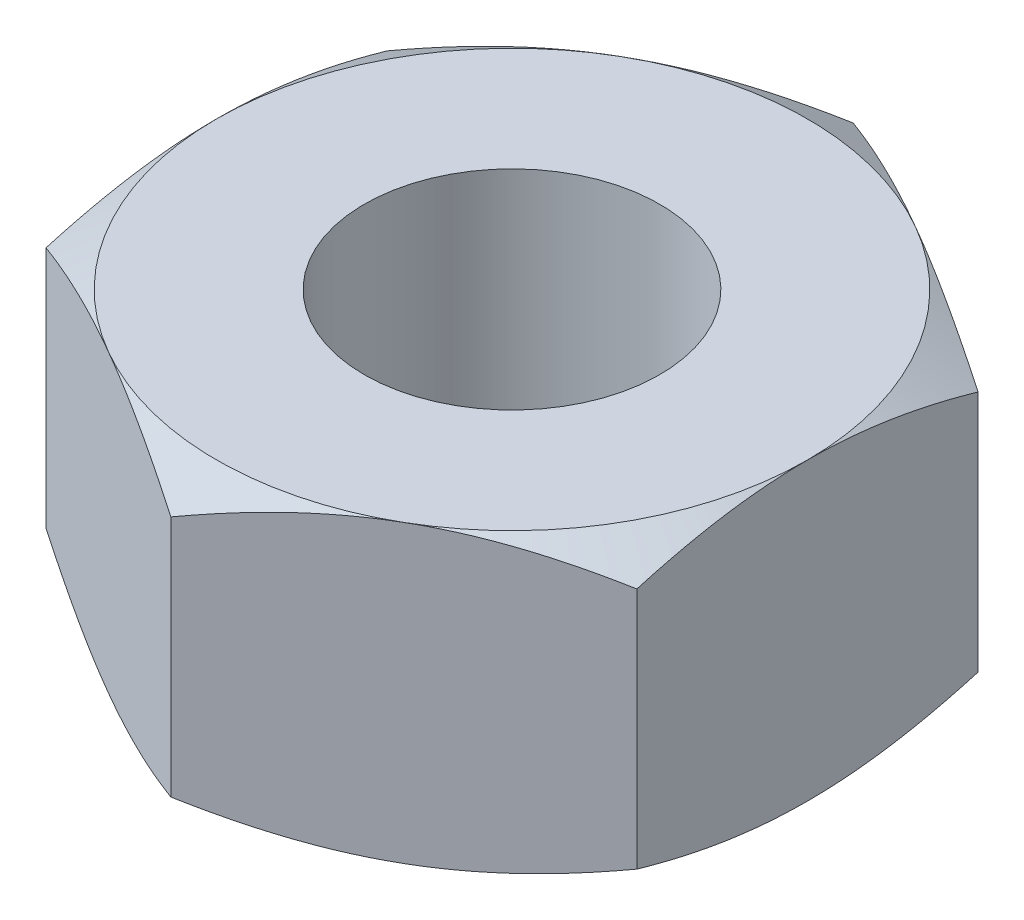
ISO-10303-21;
HEADER;
FILE_DESCRIPTION(('STEP AP214'),'2;1');
FILE_NAME('part.step','',(''),(''),'','','');
FILE_SCHEMA(('AUTOMOTIVE_DESIGN { 1 0 10303 214 1 1 1 1 }'));
ENDSEC;
DATA;
#1=APPLICATION_CONTEXT('core data for automotive mechanical design processes');
#2=APPLICATION_PROTOCOL_DEFINITION('international standard','automotive_design',2000,#1);
#3=PRODUCT_CONTEXT('',#1,'mechanical');
#4=PRODUCT('Part','Part','',(#3));
#5=PRODUCT_RELATED_PRODUCT_CATEGORY('part','',(#4));
#6=PRODUCT_DEFINITION_FORMATION('','',#4);
#7=PRODUCT_DEFINITION_CONTEXT('part definition',#1,'design');
#8=PRODUCT_DEFINITION('design','',#6,#7);
#9=PRODUCT_DEFINITION_SHAPE('','',#8);
#10=(LENGTH_UNIT() NAMED_UNIT(*) SI_UNIT(.MILLI.,.METRE.));
#11=(NAMED_UNIT(*) PLANE_ANGLE_UNIT() SI_UNIT($,.RADIAN.));
#12=(NAMED_UNIT(*) SI_UNIT($,.STERADIAN.) SOLID_ANGLE_UNIT());
#13=UNCERTAINTY_MEASURE_WITH_UNIT(LENGTH_MEASURE(1.E-05),#10,'distance_accuracy_value','');
#14=(GEOMETRIC_REPRESENTATION_CONTEXT(3) GLOBAL_UNCERTAINTY_ASSIGNED_CONTEXT((#13)) GLOBAL_UNIT_ASSIGNED_CONTEXT((#10,
#11,#12)) REPRESENTATION_CONTEXT('',''));
#15=CARTESIAN_POINT('',(0.,0.,0.));
#16=DIRECTION('',(0.,0.,1.));
#17=DIRECTION('',(1.,0.,0.));
#18=AXIS2_PLACEMENT_3D('',#15,#16,#17);
#19=CARTESIAN_POINT('',(2.,2.,-1.15470053837925));
#20=DIRECTION('',(-0.5,0.,0.866025403784439));
#21=DIRECTION('',(0.866025403784439,0.,0.5));
#22=AXIS2_PLACEMENT_3D('',#19,#20,#21);
#23=PLANE('',#22);
#24=CARTESIAN_POINT('',(-0.000200000000000763,0.178699466620498,-2.30951654681234));
#25=CARTESIAN_POINT('',(0.0876912629000593,0.149389536100678,-2.25877250251758));
#26=CARTESIAN_POINT('',(0.17634119447359,0.122732851980467,-2.20759044065996));
#27=CARTESIAN_POINT('',(0.355176246997801,0.0762024910207211,-2.10433997494456));
#28=CARTESIAN_POINT('',(0.445364546505036,0.0563452763827793,-2.0522697359463));
#29=CARTESIAN_POINT('',(0.624623385763305,0.0254334640232528,-1.94877459684592));
#30=CARTESIAN_POINT('',(0.713666338226303,0.0141731515985312,-1.89736562427197));
#31=CARTESIAN_POINT('',(0.892171397785042,0.000728662594641872,-1.79430568008402));
#32=CARTESIAN_POINT('',(0.981632855703957,-0.00146664504653174,-1.74265508327244));
#33=CARTESIAN_POINT('',(1.1488083535488,0.0030909893306489,-1.64613626458981));
#34=CARTESIAN_POINT('',(1.22654737026578,0.00872487468701465,-1.60125362236173));
#35=CARTESIAN_POINT('',(1.38151891453613,0.0265838952608283,-1.51178075956051));
#36=CARTESIAN_POINT('',(1.4587509057412,0.0388151360234393,-1.46719084864821));
#37=CARTESIAN_POINT('',(1.6140421864822,0.0693934368676097,-1.37753338590959));
#38=CARTESIAN_POINT('',(1.69208181310738,0.0878701670657159,-1.33247718647009));
#39=CARTESIAN_POINT('',(1.84699686569213,0.129805518212856,-1.24303693915875));
#40=CARTESIAN_POINT('',(1.92387427762312,0.153254280492313,-1.1986517446858));
#41=CARTESIAN_POINT('',(2.0002,0.178699466620497,-1.15458506832541));
#42=B_SPLINE_CURVE_WITH_KNOTS('',3,(#24,#25,#26,#27,#28,#29,#30,#31,#32,#33,#34,#35,#36,#37,#38,
#39,#40,#41),.UNSPECIFIED.,.F.,.F.,(4,2,2,2,2,2,2,2,4),(0.,0.317031824695609,0.634825876346563,
0.944753967652635,1.25430138000371,1.52387047293094,1.79368946861028,2.06949491027634,
2.34475850821472),.UNSPECIFIED.);
#43=CARTESIAN_POINT('',(0.,0.178632794954081,-2.3094010767585));
#44=VERTEX_POINT('',#43);
#45=CARTESIAN_POINT('',(0.999999999999999,0.,-1.73205080756888));
#46=VERTEX_POINT('',#45);
#47=EDGE_CURVE('E53',#44,#46,#42,.T.);
#48=ORIENTED_EDGE('',*,*,#47,.F.);
#49=DIRECTION('',(0.,-1.,0.));
#50=VECTOR('',#49,1.);
#51=CARTESIAN_POINT('',(0.,2.,-2.3094010767585));
#52=LINE('',#51,#50);
#53=CARTESIAN_POINT('',(0.,1.82136720504592,-2.3094010767585));
#54=VERTEX_POINT('',#53);
#55=EDGE_CURVE('E279',#54,#44,#52,.T.);
#56=ORIENTED_EDGE('',*,*,#55,.F.);
#57=CARTESIAN_POINT('',(2.0002,1.8213005333795,-1.15458506832541));
#58=CARTESIAN_POINT('',(1.91230873709994,1.85061046389932,-1.20532911262018));
#59=CARTESIAN_POINT('',(1.82365880552641,1.87726714801953,-1.2565111744778));
#60=CARTESIAN_POINT('',(1.6448237530022,1.92379750897928,-1.35976164019319));
#61=CARTESIAN_POINT('',(1.55463545349496,1.94365472361722,-1.41183187919145));
#62=CARTESIAN_POINT('',(1.37537661423669,1.97456653597675,-1.51532701829183));
#63=CARTESIAN_POINT('',(1.2863336617737,1.98582684840147,-1.56673599086578));
#64=CARTESIAN_POINT('',(1.10782860221496,1.99927133740536,-1.66979593505373));
#65=CARTESIAN_POINT('',(1.01836714429604,2.00146664504653,-1.72144653186531));
#66=CARTESIAN_POINT('',(0.851191646451201,1.99690901066935,-1.81796535054794));
#67=CARTESIAN_POINT('',(0.773452629734215,1.99127512531299,-1.86284799277603));
#68=CARTESIAN_POINT('',(0.618481085463866,1.97341610473917,-1.95232085557725));
#69=CARTESIAN_POINT('',(0.541249094258801,1.96118486397656,-1.99691076648954));
#70=CARTESIAN_POINT('',(0.385957813517798,1.93060656313239,-2.08656822922816));
#71=CARTESIAN_POINT('',(0.30791818689262,1.91212983293428,-2.13162442866767));
#72=CARTESIAN_POINT('',(0.153003134307865,1.87019448178714,-2.221064675979));
#73=CARTESIAN_POINT('',(0.0761257223768794,1.84674571950769,-2.26544987045196));
#74=CARTESIAN_POINT('',(-0.000200000000000733,1.8213005333795,-2.30951654681234));
#75=B_SPLINE_CURVE_WITH_KNOTS('',3,(#57,#58,#59,#60,#61,#62,#63,#64,#65,#66,#67,#68,#69,#70,#71,
#72,#73,#74),.UNSPECIFIED.,.F.,.F.,(4,2,2,2,2,2,2,2,4),(0.,0.317031824695609,0.634825876346563,
0.944753967652635,1.25430138000371,1.52387047293094,1.79368946861028,2.06949491027634,
2.34475850821472),.UNSPECIFIED.);
#76=CARTESIAN_POINT('',(0.999999999999999,2.,-1.73205080756888));
#77=VERTEX_POINT('',#76);
#78=EDGE_CURVE('E251',#77,#54,#75,.T.);
#79=ORIENTED_EDGE('',*,*,#78,.F.);
#80=CARTESIAN_POINT('',(2.,1.82136720504592,-1.15470053837926));
#81=VERTEX_POINT('',#80);
#82=EDGE_CURVE('E319',#81,#77,#75,.T.);
#83=ORIENTED_EDGE('',*,*,#82,.F.);
#84=DIRECTION('',(0.,-1.,0.));
#85=VECTOR('',#84,1.);
#86=CARTESIAN_POINT('',(2.,2.,-1.15470053837925));
#87=LINE('',#86,#85);
#88=CARTESIAN_POINT('',(2.,0.178632794954081,-1.15470053837925));
#89=VERTEX_POINT('',#88);
#90=EDGE_CURVE('E321',#81,#89,#87,.T.);
#91=ORIENTED_EDGE('',*,*,#90,.T.);
#92=EDGE_CURVE('E138',#46,#89,#42,.T.);
#93=ORIENTED_EDGE('',*,*,#92,.F.);
#94=EDGE_LOOP('',(#48,#56,#79,#83,#91,#93));
#95=FACE_BOUND('',#94,.T.);
#96=ADVANCED_FACE('F37',(#95),#23,.F.);
#97=CARTESIAN_POINT('',(0.,2.,-2.3094010767585));
#98=DIRECTION('',(0.5,0.,0.866025403784439));
#99=DIRECTION('',(0.866025403784439,0.,-0.5));
#100=AXIS2_PLACEMENT_3D('',#97,#98,#99);
#101=PLANE('',#100);
#102=CARTESIAN_POINT('',(-2.0002,0.178699466620498,-1.15458506832541));
#103=CARTESIAN_POINT('',(-1.91230873709994,0.149389536100679,-1.20532911262018));
#104=CARTESIAN_POINT('',(-1.82365880552641,0.122732851980467,-1.2565111744778));
#105=CARTESIAN_POINT('',(-1.6448237530022,0.0762024910207211,-1.35976164019319));
#106=CARTESIAN_POINT('',(-1.55463545349496,0.0563452763827793,-1.41183187919145));
#107=CARTESIAN_POINT('',(-1.37537661423669,0.0254334640232529,-1.51532701829183));
#108=CARTESIAN_POINT('',(-1.2863336617737,0.0141731515985316,-1.56673599086578));
#109=CARTESIAN_POINT('',(-1.10782860221496,0.000728662594642286,-1.66979593505373));
#110=CARTESIAN_POINT('',(-1.01836714429604,-0.00146664504653146,-1.72144653186531));
#111=CARTESIAN_POINT('',(-0.851191646451202,0.00309098933064913,-1.81796535054794));
#112=CARTESIAN_POINT('',(-0.773452629734217,0.00872487468701495,-1.86284799277603));
#113=CARTESIAN_POINT('',(-0.618481085463867,0.0265838952608288,-1.95232085557725));
#114=CARTESIAN_POINT('',(-0.541249094258802,0.0388151360234398,-1.99691076648954));
#115=CARTESIAN_POINT('',(-0.3859578135178,0.0693934368676101,-2.08656822922816));
#116=CARTESIAN_POINT('',(-0.307918186892621,0.0878701670657161,-2.13162442866767));
#117=CARTESIAN_POINT('',(-0.153003134307866,0.129805518212856,-2.221064675979));
#118=CARTESIAN_POINT('',(-0.0761257223768804,0.153254280492313,-2.26544987045196));
#119=CARTESIAN_POINT('',(0.000199999999999368,0.178699466620498,-2.30951654681234));
#120=B_SPLINE_CURVE_WITH_KNOTS('',3,(#102,#103,#104,#105,#106,#107,#108,#109,#110,#111,#112,
#113,#114,#115,#116,#117,#118,#119),.UNSPECIFIED.,.F.,.F.,(4,2,2,2,2,2,2,2,4),(0.,
0.31703182469561,0.634825876346563,0.944753967652636,1.25430138000371,1.52387047293094,
1.79368946861028,2.06949491027634,2.34475850821472),.UNSPECIFIED.);
#121=CARTESIAN_POINT('',(-2.,0.178632794954081,-1.15470053837925));
#122=VERTEX_POINT('',#121);
#123=CARTESIAN_POINT('',(-1.,0.,-1.73205080756888));
#124=VERTEX_POINT('',#123);
#125=EDGE_CURVE('E61',#122,#124,#120,.T.);
#126=ORIENTED_EDGE('',*,*,#125,.F.);
#127=DIRECTION('',(0.,-1.,0.));
#128=VECTOR('',#127,1.);
#129=CARTESIAN_POINT('',(-2.,2.,-1.15470053837925));
#130=LINE('',#129,#128);
#131=CARTESIAN_POINT('',(-2.,1.82136720504592,-1.15470053837925));
#132=VERTEX_POINT('',#131);
#133=EDGE_CURVE('E272',#132,#122,#130,.T.);
#134=ORIENTED_EDGE('',*,*,#133,.F.);
#135=CARTESIAN_POINT('',(0.0001999999999992,1.8213005333795,-2.30951654681234));
#136=CARTESIAN_POINT('',(-0.0876912629000608,1.85061046389932,-2.25877250251758));
#137=CARTESIAN_POINT('',(-0.176341194473592,1.87726714801953,-2.20759044065996));
#138=CARTESIAN_POINT('',(-0.355176246997803,1.92379750897928,-2.10433997494456));
#139=CARTESIAN_POINT('',(-0.445364546505037,1.94365472361722,-2.05226973594631));
#140=CARTESIAN_POINT('',(-0.624623385763307,1.97456653597675,-1.94877459684592));
#141=CARTESIAN_POINT('',(-0.713666338226305,1.98582684840147,-1.89736562427197));
#142=CARTESIAN_POINT('',(-0.892171397785044,1.99927133740536,-1.79430568008402));
#143=CARTESIAN_POINT('',(-0.981632855703959,2.00146664504653,-1.74265508327244));
#144=CARTESIAN_POINT('',(-1.1488083535488,1.99690901066935,-1.64613626458981));
#145=CARTESIAN_POINT('',(-1.22654737026578,1.99127512531299,-1.60125362236173));
#146=CARTESIAN_POINT('',(-1.38151891453613,1.97341610473917,-1.51178075956051));
#147=CARTESIAN_POINT('',(-1.4587509057412,1.96118486397656,-1.46719084864821));
#148=CARTESIAN_POINT('',(-1.6140421864822,1.93060656313239,-1.37753338590959));
#149=CARTESIAN_POINT('',(-1.69208181310738,1.91212983293428,-1.33247718647009));
#150=CARTESIAN_POINT('',(-1.84699686569214,1.87019448178714,-1.24303693915875));
#151=CARTESIAN_POINT('',(-1.92387427762312,1.84674571950769,-1.1986517446858));
#152=CARTESIAN_POINT('',(-2.0002,1.8213005333795,-1.15458506832541));
#153=B_SPLINE_CURVE_WITH_KNOTS('',3,(#135,#136,#137,#138,#139,#140,#141,#142,#143,#144,#145,
#146,#147,#148,#149,#150,#151,#152),.UNSPECIFIED.,.F.,.F.,(4,2,2,2,2,2,2,2,4),(0.,
0.31703182469561,0.634825876346563,0.944753967652636,1.25430138000371,1.52387047293094,
1.79368946861028,2.06949491027634,2.34475850821472),.UNSPECIFIED.);
#154=CARTESIAN_POINT('',(-1.,2.,-1.73205080756888));
#155=VERTEX_POINT('',#154);
#156=EDGE_CURVE('E244',#155,#132,#153,.T.);
#157=ORIENTED_EDGE('',*,*,#156,.F.);
#158=EDGE_CURVE('E250',#54,#155,#153,.T.);
#159=ORIENTED_EDGE('',*,*,#158,.F.);
#160=ORIENTED_EDGE('',*,*,#55,.T.);
#161=EDGE_CURVE('E161',#124,#44,#120,.T.);
#162=ORIENTED_EDGE('',*,*,#161,.F.);
#163=EDGE_LOOP('',(#126,#134,#157,#159,#160,#162));
#164=FACE_BOUND('',#163,.T.);
#165=ADVANCED_FACE('F257',(#164),#101,.F.);
#166=CARTESIAN_POINT('',(-2.,2.,-1.15470053837925));
#167=DIRECTION('',(1.,0.,0.));
#168=DIRECTION('',(0.,0.,-1.));
#169=AXIS2_PLACEMENT_3D('',#166,#167,#168);
#170=PLANE('',#169);
#171=CARTESIAN_POINT('',(-2.,1.48527851081329,4.11199077583192));
#172=CARTESIAN_POINT('',(-2.,1.43556064912627,4.01621889999879));
#173=CARTESIAN_POINT('',(-2.,1.3860944255792,3.92031530027965));
#174=CARTESIAN_POINT('',(-2.,1.28779407427013,3.72818291926333));
#175=CARTESIAN_POINT('',(-2.,1.23895995674012,3.631954132734));
#176=CARTESIAN_POINT('',(-2.,1.14197770267674,3.43896040283808));
#177=CARTESIAN_POINT('',(-2.,1.09383077181164,3.34219485259439));
#178=CARTESIAN_POINT('',(-2.,0.998479885570913,3.14819793764471));
#179=CARTESIAN_POINT('',(-2.,0.951275943075933,3.05096656659833));
#180=CARTESIAN_POINT('',(-2.,0.855458409955278,2.85053512168431));
#181=CARTESIAN_POINT('',(-2.,0.806911736470797,2.74730297037766));
#182=CARTESIAN_POINT('',(-2.,0.711493100390036,2.54006824196301));
#183=CARTESIAN_POINT('',(-2.,0.664621094945287,2.43606568464913));
#184=CARTESIAN_POINT('',(-2.,0.573080172427993,2.22717408130948));
#185=CARTESIAN_POINT('',(-2.,0.52840979119064,2.12228568029937));
#186=CARTESIAN_POINT('',(-2.,0.441918323549794,1.91130709903764));
#187=CARTESIAN_POINT('',(-2.,0.400097863664024,1.80521666047395));
#188=CARTESIAN_POINT('',(-2.,0.315154144144186,1.57793145478542));
#189=CARTESIAN_POINT('',(-2.,0.272548573404193,1.45654057209064));
#190=CARTESIAN_POINT('',(-2.,0.194083857834814,1.21162099045195));
#191=CARTESIAN_POINT('',(-2.,0.158221425471686,1.0880933654963));
#192=CARTESIAN_POINT('',(-2.,0.0963560948112605,0.841146101707505));
#193=CARTESIAN_POINT('',(-2.,0.0701708352319793,0.717773436781328));
#194=CARTESIAN_POINT('',(-2.,0.0293524563339624,0.469134271856654));
#195=CARTESIAN_POINT('',(-2.,0.0147123206570906,0.343868969330864));
#196=CARTESIAN_POINT('',(-2.,-0.00113662864390631,0.090487427083638));
#197=CARTESIAN_POINT('',(-2.,-0.00213264744638916,-0.037642825220359));
#198=CARTESIAN_POINT('',(-2.,0.0100200278550488,-0.293230873703655));
#199=CARTESIAN_POINT('',(-2.,0.0231726133836598,-0.420688475186085));
#200=CARTESIAN_POINT('',(-2.,0.0621057262002386,-0.676342906930762));
#201=CARTESIAN_POINT('',(-2.,0.088147692363252,-0.804498264161085));
#202=CARTESIAN_POINT('',(-2.,0.150024683567195,-1.05840042525138));
#203=CARTESIAN_POINT('',(-2.,0.185863718360607,-1.18414622032496));
#204=CARTESIAN_POINT('',(-2.,0.26511351224471,-1.43483581350434));
#205=CARTESIAN_POINT('',(-2.,0.308609626530992,-1.55975207603836));
#206=CARTESIAN_POINT('',(-2.,0.400793385214287,-1.80767043600752));
#207=CARTESIAN_POINT('',(-2.,0.449482610705792,-1.93067193733758));
#208=CARTESIAN_POINT('',(-2.,0.550637062875052,-2.17527287229393));
#209=CARTESIAN_POINT('',(-2.,0.60310678384142,-2.29687043090538));
#210=CARTESIAN_POINT('',(-2.,0.710763033205786,-2.5388586671706));
#211=CARTESIAN_POINT('',(-2.,0.7659497287733,-2.65924927001311));
#212=CARTESIAN_POINT('',(-2.,0.87489068429636,-2.89171848429236));
#213=CARTESIAN_POINT('',(-2.,0.928524863524456,-3.00385360768881));
#214=CARTESIAN_POINT('',(-2.,1.03716744685329,-3.22746009057916));
#215=CARTESIAN_POINT('',(-2.,1.09217590469003,-3.33893142390634));
#216=CARTESIAN_POINT('',(-2.,1.20305571911547,-3.56091834981154));
#217=CARTESIAN_POINT('',(-2.,1.25892304402674,-3.6714359609046));
#218=CARTESIAN_POINT('',(-2.,1.37151099549244,-3.89202309820636));
#219=CARTESIAN_POINT('',(-2.,1.4282315424678,-4.0020926650018));
#220=CARTESIAN_POINT('',(-2.,1.48527851081329,-4.11199077583192));
#221=B_SPLINE_CURVE_WITH_KNOTS('',3,(#171,#172,#173,#174,#175,#176,#177,#178,#179,#180,#181,
#182,#183,#184,#185,#186,#187,#188,#189,#190,#191,#192,#193,#194,#195,#196,#197,#198,#199,#200,
#201,#202,#203,#204,#205,#206,#207,#208,#209,#210,#211,#212,#213,#214,#215,#216,#217,#218,#219,
#220),.UNSPECIFIED.,.F.,.F.,(4,2,2,2,2,2,2,2,2,2,2,2,2,2,2,2,2,2,2,2,2,2,2,2,4),(0.,
0.32372481305476,0.64745485975366,0.971696364799469,1.29594229576278,1.63816292018737,
1.98037478219133,2.3223559012748,2.66441195948731,3.05022429601378,3.43584804399959,
3.81378148436164,4.19148506453753,4.57507275328391,4.95876597076716,5.3505819713692,
5.74255857547208,6.13921877430159,6.53600008689406,6.93326113751857,7.33054666137,
7.70344029330569,8.07634852873628,8.44785185771417,8.81932074922118),.UNSPECIFIED.);
#222=CARTESIAN_POINT('',(-2.,0.178632794954081,1.15470053837925));
#223=VERTEX_POINT('',#222);
#224=CARTESIAN_POINT('',(-2.,0.,0.));
#225=VERTEX_POINT('',#224);
#226=EDGE_CURVE('E348',#223,#225,#221,.T.);
#227=ORIENTED_EDGE('',*,*,#226,.F.);
#228=DIRECTION('',(0.,-1.,0.));
#229=VECTOR('',#228,1.);
#230=CARTESIAN_POINT('',(-2.,2.,1.15470053837925));
#231=LINE('',#230,#229);
#232=CARTESIAN_POINT('',(-2.,1.82136720504592,1.15470053837925));
#233=VERTEX_POINT('',#232);
#234=EDGE_CURVE('E280',#233,#223,#231,.T.);
#235=ORIENTED_EDGE('',*,*,#234,.F.);
#236=CARTESIAN_POINT('',(-2.,0.514721489186708,-4.11199077583192));
#237=CARTESIAN_POINT('',(-2.,0.564439350873725,-4.01621889999879));
#238=CARTESIAN_POINT('',(-2.,0.613905574420801,-3.92031530027965));
#239=CARTESIAN_POINT('',(-2.,0.712205925729873,-3.72818291926333));
#240=CARTESIAN_POINT('',(-2.,0.761040043259875,-3.631954132734));
#241=CARTESIAN_POINT('',(-2.,0.858022297323263,-3.43896040283808));
#242=CARTESIAN_POINT('',(-2.,0.906169228188361,-3.34219485259439));
#243=CARTESIAN_POINT('',(-2.,1.00152011442909,-3.14819793764471));
#244=CARTESIAN_POINT('',(-2.,1.04872405692407,-3.05096656659833));
#245=CARTESIAN_POINT('',(-2.,1.14454159004472,-2.85053512168431));
#246=CARTESIAN_POINT('',(-2.,1.1930882635292,-2.74730297037766));
#247=CARTESIAN_POINT('',(-2.,1.28850689960996,-2.54006824196301));
#248=CARTESIAN_POINT('',(-2.,1.33537890505471,-2.43606568464913));
#249=CARTESIAN_POINT('',(-2.,1.42691982757201,-2.22717408130948));
#250=CARTESIAN_POINT('',(-2.,1.47159020880936,-2.12228568029937));
#251=CARTESIAN_POINT('',(-2.,1.55808167645021,-1.91130709903764));
#252=CARTESIAN_POINT('',(-2.,1.59990213633598,-1.80521666047395));
#253=CARTESIAN_POINT('',(-2.,1.68484585585581,-1.57793145478542));
#254=CARTESIAN_POINT('',(-2.,1.72745142659581,-1.45654057209064));
#255=CARTESIAN_POINT('',(-2.,1.80591614216519,-1.21162099045195));
#256=CARTESIAN_POINT('',(-2.,1.84177857452831,-1.0880933654963));
#257=CARTESIAN_POINT('',(-2.,1.90364390518874,-0.841146101707505));
#258=CARTESIAN_POINT('',(-2.,1.92982916476802,-0.717773436781327));
#259=CARTESIAN_POINT('',(-2.,1.97064754366604,-0.469134271856653));
#260=CARTESIAN_POINT('',(-2.,1.98528767934291,-0.343868969330863));
#261=CARTESIAN_POINT('',(-2.,2.00113662864391,-0.0904874270836378));
#262=CARTESIAN_POINT('',(-2.,2.00213264744639,0.037642825220359));
#263=CARTESIAN_POINT('',(-2.,1.98997997214495,0.293230873703655));
#264=CARTESIAN_POINT('',(-2.,1.97682738661634,0.420688475186085));
#265=CARTESIAN_POINT('',(-2.,1.93789427379976,0.676342906930762));
#266=CARTESIAN_POINT('',(-2.,1.91185230763675,0.804498264161085));
#267=CARTESIAN_POINT('',(-2.,1.84997531643281,1.05840042525138));
#268=CARTESIAN_POINT('',(-2.,1.81413628163939,1.18414622032496));
#269=CARTESIAN_POINT('',(-2.,1.73488648775529,1.43483581350434));
#270=CARTESIAN_POINT('',(-2.,1.69139037346901,1.55975207603836));
#271=CARTESIAN_POINT('',(-2.,1.59920661478571,1.80767043600752));
#272=CARTESIAN_POINT('',(-2.,1.55051738929421,1.93067193733759));
#273=CARTESIAN_POINT('',(-2.,1.44936293712495,2.17527287229394));
#274=CARTESIAN_POINT('',(-2.,1.39689321615858,2.29687043090538));
#275=CARTESIAN_POINT('',(-2.,1.28923696679421,2.5388586671706));
#276=CARTESIAN_POINT('',(-2.,1.2340502712267,2.65924927001311));
#277=CARTESIAN_POINT('',(-2.,1.12510931570364,2.89171848429237));
#278=CARTESIAN_POINT('',(-2.,1.07147513647554,3.00385360768881));
#279=CARTESIAN_POINT('',(-2.,0.962832553146711,3.22746009057916));
#280=CARTESIAN_POINT('',(-2.,0.907824095309975,3.33893142390634));
#281=CARTESIAN_POINT('',(-2.,0.796944280884527,3.56091834981154));
#282=CARTESIAN_POINT('',(-2.,0.741076955973262,3.6714359609046));
#283=CARTESIAN_POINT('',(-2.,0.628489004507557,3.89202309820636));
#284=CARTESIAN_POINT('',(-2.,0.571768457532199,4.0020926650018));
#285=CARTESIAN_POINT('',(-2.,0.514721489186709,4.11199077583192));
#286=B_SPLINE_CURVE_WITH_KNOTS('',3,(#236,#237,#238,#239,#240,#241,#242,#243,#244,#245,#246,
#247,#248,#249,#250,#251,#252,#253,#254,#255,#256,#257,#258,#259,#260,#261,#262,#263,#264,#265,
#266,#267,#268,#269,#270,#271,#272,#273,#274,#275,#276,#277,#278,#279,#280,#281,#282,#283,#284,
#285),.UNSPECIFIED.,.F.,.F.,(4,2,2,2,2,2,2,2,2,2,2,2,2,2,2,2,2,2,2,2,2,2,2,2,4),(0.,
0.32372481305476,0.64745485975366,0.971696364799469,1.29594229576278,1.63816292018737,
1.98037478219133,2.3223559012748,2.66441195948731,3.05022429601378,3.4358480439996,
3.81378148436164,4.19148506453753,4.57507275328391,4.95876597076716,5.3505819713692,
5.74255857547208,6.13921877430159,6.53600008689406,6.93326113751857,7.33054666137,
7.70344029330569,8.07634852873628,8.44785185771417,8.81932074922118),.UNSPECIFIED.);
#287=CARTESIAN_POINT('',(-2.,2.,0.));
#288=VERTEX_POINT('',#287);
#289=EDGE_CURVE('E237',#288,#233,#286,.T.);
#290=ORIENTED_EDGE('',*,*,#289,.F.);
#291=EDGE_CURVE('E243',#132,#288,#286,.T.);
#292=ORIENTED_EDGE('',*,*,#291,.F.);
#293=ORIENTED_EDGE('',*,*,#133,.T.);
#294=EDGE_CURVE('E196',#225,#122,#221,.T.);
#295=ORIENTED_EDGE('',*,*,#294,.F.);
#296=EDGE_LOOP('',(#227,#235,#290,#292,#293,#295));
#297=FACE_BOUND('',#296,.T.);
#298=ADVANCED_FACE('F218',(#297),#170,.F.);
#299=CARTESIAN_POINT('',(-2.,2.,1.15470053837925));
#300=DIRECTION('',(0.5,0.,-0.866025403784439));
#301=DIRECTION('',(-0.866025403784439,0.,-0.5));
#302=AXIS2_PLACEMENT_3D('',#299,#300,#301);
#303=PLANE('',#302);
#304=CARTESIAN_POINT('',(0.000200000000000405,0.178699466620497,2.30951654681234));
#305=CARTESIAN_POINT('',(-0.0876912629000595,0.149389536100679,2.25877250251758));
#306=CARTESIAN_POINT('',(-0.176341194473591,0.122732851980467,2.20759044065995));
#307=CARTESIAN_POINT('',(-0.355176246997802,0.0762024910207209,2.10433997494456));
#308=CARTESIAN_POINT('',(-0.445364546505036,0.056345276382779,2.0522697359463));
#309=CARTESIAN_POINT('',(-0.624623385763305,0.0254334640232525,1.94877459684592));
#310=CARTESIAN_POINT('',(-0.713666338226303,0.0141731515985313,1.89736562427197));
#311=CARTESIAN_POINT('',(-0.892171397785043,0.000728662594642053,1.79430568008402));
#312=CARTESIAN_POINT('',(-0.981632855703958,-0.0014666450465317,1.74265508327244));
#313=CARTESIAN_POINT('',(-1.1488083535488,0.00309098933064881,1.64613626458981));
#314=CARTESIAN_POINT('',(-1.22654737026578,0.00872487468701457,1.60125362236173));
#315=CARTESIAN_POINT('',(-1.38151891453613,0.0265838952608284,1.51178075956051));
#316=CARTESIAN_POINT('',(-1.4587509057412,0.0388151360234394,1.46719084864821));
#317=CARTESIAN_POINT('',(-1.6140421864822,0.0693934368676098,1.37753338590959));
#318=CARTESIAN_POINT('',(-1.69208181310738,0.0878701670657158,1.33247718647009));
#319=CARTESIAN_POINT('',(-1.84699686569213,0.129805518212856,1.24303693915875));
#320=CARTESIAN_POINT('',(-1.92387427762312,0.153254280492313,1.1986517446858));
#321=CARTESIAN_POINT('',(-2.0002,0.178699466620497,1.15458506832541));
#322=B_SPLINE_CURVE_WITH_KNOTS('',3,(#304,#305,#306,#307,#308,#309,#310,#311,#312,#313,#314,
#315,#316,#317,#318,#319,#320,#321),.UNSPECIFIED.,.F.,.F.,(4,2,2,2,2,2,2,2,4),(0.,
0.31703182469561,0.634825876346563,0.944753967652636,1.25430138000371,1.52387047293094,
1.79368946861028,2.06949491027634,2.34475850821472),.UNSPECIFIED.);
#323=CARTESIAN_POINT('',(0.,0.178632794954081,2.3094010767585));
#324=VERTEX_POINT('',#323);
#325=CARTESIAN_POINT('',(-0.999999999999999,0.,1.73205080756888));
#326=VERTEX_POINT('',#325);
#327=EDGE_CURVE('E147',#324,#326,#322,.T.);
#328=ORIENTED_EDGE('',*,*,#327,.F.);
#329=DIRECTION('',(0.,-1.,0.));
#330=VECTOR('',#329,1.);
#331=CARTESIAN_POINT('',(0.,2.,2.3094010767585));
#332=LINE('',#331,#330);
#333=CARTESIAN_POINT('',(0.,1.82136720504592,2.3094010767585));
#334=VERTEX_POINT('',#333);
#335=EDGE_CURVE('E160',#334,#324,#332,.T.);
#336=ORIENTED_EDGE('',*,*,#335,.F.);
#337=CARTESIAN_POINT('',(-2.0002,1.8213005333795,1.15458506832541));
#338=CARTESIAN_POINT('',(-1.91230873709994,1.85061046389932,1.20532911262018));
#339=CARTESIAN_POINT('',(-1.82365880552641,1.87726714801953,1.2565111744778));
#340=CARTESIAN_POINT('',(-1.6448237530022,1.92379750897928,1.35976164019319));
#341=CARTESIAN_POINT('',(-1.55463545349496,1.94365472361722,1.41183187919145));
#342=CARTESIAN_POINT('',(-1.37537661423669,1.97456653597675,1.51532701829183));
#343=CARTESIAN_POINT('',(-1.2863336617737,1.98582684840147,1.56673599086578));
#344=CARTESIAN_POINT('',(-1.10782860221496,1.99927133740536,1.66979593505373));
#345=CARTESIAN_POINT('',(-1.01836714429604,2.00146664504653,1.72144653186531));
#346=CARTESIAN_POINT('',(-0.851191646451201,1.99690901066935,1.81796535054794));
#347=CARTESIAN_POINT('',(-0.773452629734216,1.99127512531299,1.86284799277603));
#348=CARTESIAN_POINT('',(-0.618481085463866,1.97341610473917,1.95232085557725));
#349=CARTESIAN_POINT('',(-0.541249094258801,1.96118486397656,1.99691076648954));
#350=CARTESIAN_POINT('',(-0.385957813517798,1.93060656313239,2.08656822922816));
#351=CARTESIAN_POINT('',(-0.30791818689262,1.91212983293428,2.13162442866767));
#352=CARTESIAN_POINT('',(-0.153003134307864,1.87019448178714,2.221064675979));
#353=CARTESIAN_POINT('',(-0.0761257223768792,1.84674571950769,2.26544987045196));
#354=CARTESIAN_POINT('',(0.000200000000000645,1.8213005333795,2.30951654681234));
#355=B_SPLINE_CURVE_WITH_KNOTS('',3,(#337,#338,#339,#340,#341,#342,#343,#344,#345,#346,#347,
#348,#349,#350,#351,#352,#353,#354),.UNSPECIFIED.,.F.,.F.,(4,2,2,2,2,2,2,2,4),(0.,
0.31703182469561,0.634825876346563,0.944753967652635,1.25430138000371,1.52387047293094,
1.79368946861028,2.06949491027634,2.34475850821472),.UNSPECIFIED.);
#356=CARTESIAN_POINT('',(-0.999999999999999,2.,1.73205080756888));
#357=VERTEX_POINT('',#356);
#358=EDGE_CURVE('E223',#357,#334,#355,.T.);
#359=ORIENTED_EDGE('',*,*,#358,.F.);
#360=EDGE_CURVE('E230',#233,#357,#355,.T.);
#361=ORIENTED_EDGE('',*,*,#360,.F.);
#362=ORIENTED_EDGE('',*,*,#234,.T.);
#363=EDGE_CURVE('E163',#326,#223,#322,.T.);
#364=ORIENTED_EDGE('',*,*,#363,.F.);
#365=EDGE_LOOP('',(#328,#336,#359,#361,#362,#364));
#366=FACE_BOUND('',#365,.T.);
#367=ADVANCED_FACE('F215',(#366),#303,.F.);
#368=CARTESIAN_POINT('',(0.,2.,2.3094010767585));
#369=DIRECTION('',(-0.5,0.,-0.866025403784439));
#370=DIRECTION('',(-0.866025403784439,0.,0.5));
#371=AXIS2_PLACEMENT_3D('',#368,#369,#370);
#372=PLANE('',#371);
#373=CARTESIAN_POINT('',(2.0002,0.178699466620497,1.15458506832541));
#374=CARTESIAN_POINT('',(1.91230873709994,0.149389536100679,1.20532911262018));
#375=CARTESIAN_POINT('',(1.82365880552641,0.122732851980467,1.2565111744778));
#376=CARTESIAN_POINT('',(1.6448237530022,0.076202491020721,1.35976164019319));
#377=CARTESIAN_POINT('',(1.55463545349496,0.0563452763827791,1.41183187919145));
#378=CARTESIAN_POINT('',(1.37537661423669,0.0254334640232525,1.51532701829183));
#379=CARTESIAN_POINT('',(1.2863336617737,0.0141731515985312,1.56673599086578));
#380=CARTESIAN_POINT('',(1.10782860221496,0.000728662594642011,1.66979593505373));
#381=CARTESIAN_POINT('',(1.01836714429604,-0.00146664504653165,1.72144653186531));
#382=CARTESIAN_POINT('',(0.851191646451202,0.00309098933064895,1.81796535054794));
#383=CARTESIAN_POINT('',(0.773452629734216,0.00872487468701472,1.86284799277603));
#384=CARTESIAN_POINT('',(0.618481085463867,0.0265838952608284,1.95232085557725));
#385=CARTESIAN_POINT('',(0.541249094258802,0.0388151360234394,1.99691076648954));
#386=CARTESIAN_POINT('',(0.385957813517799,0.0693934368676097,2.08656822922816));
#387=CARTESIAN_POINT('',(0.30791818689262,0.0878701670657158,2.13162442866767));
#388=CARTESIAN_POINT('',(0.153003134307865,0.129805518212856,2.221064675979));
#389=CARTESIAN_POINT('',(0.0761257223768801,0.153254280492313,2.26544987045196));
#390=CARTESIAN_POINT('',(-0.000199999999999947,0.178699466620497,2.30951654681234));
#391=B_SPLINE_CURVE_WITH_KNOTS('',3,(#373,#374,#375,#376,#377,#378,#379,#380,#381,#382,#383,
#384,#385,#386,#387,#388,#389,#390),.UNSPECIFIED.,.F.,.F.,(4,2,2,2,2,2,2,2,4),(0.,
0.31703182469561,0.634825876346563,0.944753967652635,1.25430138000371,1.52387047293094,
1.79368946861028,2.06949491027634,2.34475850821472),.UNSPECIFIED.);
#392=CARTESIAN_POINT('',(2.,0.178632794954078,1.15470053837926));
#393=VERTEX_POINT('',#392);
#394=CARTESIAN_POINT('',(1.,0.,1.73205080756888));
#395=VERTEX_POINT('',#394);
#396=EDGE_CURVE('E127',#393,#395,#391,.T.);
#397=ORIENTED_EDGE('',*,*,#396,.F.);
#398=DIRECTION('',(0.,-1.,0.));
#399=VECTOR('',#398,1.);
#400=CARTESIAN_POINT('',(2.,2.,1.15470053837925));
#401=LINE('',#400,#399);
#402=CARTESIAN_POINT('',(2.,1.82136720504592,1.15470053837925));
#403=VERTEX_POINT('',#402);
#404=EDGE_CURVE('E326',#403,#393,#401,.T.);
#405=ORIENTED_EDGE('',*,*,#404,.F.);
#406=CARTESIAN_POINT('',(-0.000199999999999626,1.8213005333795,2.30951654681234));
#407=CARTESIAN_POINT('',(0.08769126290006,1.85061046389932,2.25877250251758));
#408=CARTESIAN_POINT('',(0.176341194473591,1.87726714801953,2.20759044065995));
#409=CARTESIAN_POINT('',(0.355176246997802,1.92379750897928,2.10433997494456));
#410=CARTESIAN_POINT('',(0.445364546505036,1.94365472361722,2.0522697359463));
#411=CARTESIAN_POINT('',(0.624623385763306,1.97456653597675,1.94877459684592));
#412=CARTESIAN_POINT('',(0.713666338226304,1.98582684840147,1.89736562427197));
#413=CARTESIAN_POINT('',(0.892171397785043,1.99927133740536,1.79430568008402));
#414=CARTESIAN_POINT('',(0.981632855703958,2.00146664504653,1.74265508327244));
#415=CARTESIAN_POINT('',(1.1488083535488,1.99690901066935,1.64613626458981));
#416=CARTESIAN_POINT('',(1.22654737026578,1.99127512531299,1.60125362236173));
#417=CARTESIAN_POINT('',(1.38151891453613,1.97341610473917,1.51178075956051));
#418=CARTESIAN_POINT('',(1.4587509057412,1.96118486397656,1.46719084864821));
#419=CARTESIAN_POINT('',(1.6140421864822,1.93060656313239,1.37753338590959));
#420=CARTESIAN_POINT('',(1.69208181310738,1.91212983293428,1.33247718647009));
#421=CARTESIAN_POINT('',(1.84699686569213,1.87019448178714,1.24303693915875));
#422=CARTESIAN_POINT('',(1.92387427762312,1.84674571950769,1.1986517446858));
#423=CARTESIAN_POINT('',(2.0002,1.8213005333795,1.15458506832541));
#424=B_SPLINE_CURVE_WITH_KNOTS('',3,(#406,#407,#408,#409,#410,#411,#412,#413,#414,#415,#416,
#417,#418,#419,#420,#421,#422,#423),.UNSPECIFIED.,.F.,.F.,(4,2,2,2,2,2,2,2,4),(0.,
0.317031824695609,0.634825876346563,0.944753967652635,1.25430138000371,1.52387047293094,
1.79368946861028,2.06949491027634,2.34475850821472),.UNSPECIFIED.);
#425=CARTESIAN_POINT('',(1.,2.,1.73205080756888));
#426=VERTEX_POINT('',#425);
#427=EDGE_CURVE('E232',#426,#403,#424,.T.);
#428=ORIENTED_EDGE('',*,*,#427,.F.);
#429=EDGE_CURVE('E231',#334,#426,#424,.T.);
#430=ORIENTED_EDGE('',*,*,#429,.F.);
#431=ORIENTED_EDGE('',*,*,#335,.T.);
#432=EDGE_CURVE('E141',#395,#324,#391,.T.);
#433=ORIENTED_EDGE('',*,*,#432,.F.);
#434=EDGE_LOOP('',(#397,#405,#428,#430,#431,#433));
#435=FACE_BOUND('',#434,.T.);
#436=ADVANCED_FACE('F157',(#435),#372,.F.);
#437=CARTESIAN_POINT('',(2.,2.,1.15470053837925));
#438=DIRECTION('',(-1.,0.,0.));
#439=DIRECTION('',(0.,0.,1.));
#440=AXIS2_PLACEMENT_3D('',#437,#438,#439);
#441=PLANE('',#440);
#442=CARTESIAN_POINT('',(2.,1.48527851081329,-4.11199077583192));
#443=CARTESIAN_POINT('',(2.,1.43556064912627,-4.01621889999879));
#444=CARTESIAN_POINT('',(2.,1.3860944255792,-3.92031530027965));
#445=CARTESIAN_POINT('',(2.,1.28779407427013,-3.72818291926333));
#446=CARTESIAN_POINT('',(2.,1.23895995674012,-3.631954132734));
#447=CARTESIAN_POINT('',(2.,1.14197770267674,-3.43896040283808));
#448=CARTESIAN_POINT('',(2.,1.09383077181164,-3.34219485259439));
#449=CARTESIAN_POINT('',(2.,0.998479885570914,-3.14819793764471));
#450=CARTESIAN_POINT('',(2.,0.951275943075933,-3.05096656659834));
#451=CARTESIAN_POINT('',(2.,0.855458409955279,-2.85053512168431));
#452=CARTESIAN_POINT('',(2.,0.806911736470798,-2.74730297037766));
#453=CARTESIAN_POINT('',(2.,0.711493100390036,-2.54006824196301));
#454=CARTESIAN_POINT('',(2.,0.664621094945287,-2.43606568464913));
#455=CARTESIAN_POINT('',(2.,0.573080172427993,-2.22717408130948));
#456=CARTESIAN_POINT('',(2.,0.52840979119064,-2.12228568029937));
#457=CARTESIAN_POINT('',(2.,0.441918323549794,-1.91130709903764));
#458=CARTESIAN_POINT('',(2.,0.400097863664024,-1.80521666047395));
#459=CARTESIAN_POINT('',(2.,0.315154144144186,-1.57793145478542));
#460=CARTESIAN_POINT('',(2.,0.272548573404193,-1.45654057209064));
#461=CARTESIAN_POINT('',(2.,0.194083857834814,-1.21162099045195));
#462=CARTESIAN_POINT('',(2.,0.158221425471686,-1.0880933654963));
#463=CARTESIAN_POINT('',(2.,0.0963560948112606,-0.841146101707506));
#464=CARTESIAN_POINT('',(2.,0.0701708352319794,-0.717773436781329));
#465=CARTESIAN_POINT('',(2.,0.0293524563339623,-0.469134271856654));
#466=CARTESIAN_POINT('',(2.,0.0147123206570904,-0.343868969330865));
#467=CARTESIAN_POINT('',(2.,-0.0011366286439066,-0.0904874270836392));
#468=CARTESIAN_POINT('',(2.,-0.00213264744638938,0.0376428252203577));
#469=CARTESIAN_POINT('',(2.,0.0100200278550485,0.293230873703653));
#470=CARTESIAN_POINT('',(2.,0.0231726133836594,0.420688475186084));
#471=CARTESIAN_POINT('',(2.,0.062105726200238,0.676342906930761));
#472=CARTESIAN_POINT('',(2.,0.0881476923632514,0.804498264161084));
#473=CARTESIAN_POINT('',(2.,0.150024683567194,1.05840042525138));
#474=CARTESIAN_POINT('',(2.,0.185863718360606,1.18414622032496));
#475=CARTESIAN_POINT('',(2.,0.26511351224471,1.43483581350434));
#476=CARTESIAN_POINT('',(2.,0.308609626530991,1.55975207603836));
#477=CARTESIAN_POINT('',(2.,0.400793385214286,1.80767043600752));
#478=CARTESIAN_POINT('',(2.,0.449482610705791,1.93067193733758));
#479=CARTESIAN_POINT('',(2.,0.550637062875052,2.17527287229393));
#480=CARTESIAN_POINT('',(2.,0.60310678384142,2.29687043090538));
#481=CARTESIAN_POINT('',(2.,0.710763033205786,2.5388586671706));
#482=CARTESIAN_POINT('',(2.,0.765949728773299,2.65924927001311));
#483=CARTESIAN_POINT('',(2.,0.87489068429636,2.89171848429236));
#484=CARTESIAN_POINT('',(2.,0.928524863524456,3.00385360768881));
#485=CARTESIAN_POINT('',(2.,1.03716744685329,3.22746009057916));
#486=CARTESIAN_POINT('',(2.,1.09217590469003,3.33893142390634));
#487=CARTESIAN_POINT('',(2.,1.20305571911547,3.56091834981154));
#488=CARTESIAN_POINT('',(2.,1.25892304402674,3.6714359609046));
#489=CARTESIAN_POINT('',(2.,1.37151099549244,3.89202309820636));
#490=CARTESIAN_POINT('',(2.,1.4282315424678,4.0020926650018));
#491=CARTESIAN_POINT('',(2.,1.48527851081329,4.11199077583192));
#492=B_SPLINE_CURVE_WITH_KNOTS('',3,(#442,#443,#444,#445,#446,#447,#448,#449,#450,#451,#452,
#453,#454,#455,#456,#457,#458,#459,#460,#461,#462,#463,#464,#465,#466,#467,#468,#469,#470,#471,
#472,#473,#474,#475,#476,#477,#478,#479,#480,#481,#482,#483,#484,#485,#486,#487,#488,#489,#490,
#491),.UNSPECIFIED.,.F.,.F.,(4,2,2,2,2,2,2,2,2,2,2,2,2,2,2,2,2,2,2,2,2,2,2,2,4),(0.,
0.323724813054761,0.64745485975366,0.971696364799469,1.29594229576278,1.63816292018737,
1.98037478219133,2.3223559012748,2.66441195948731,3.05022429601378,3.43584804399959,
3.81378148436164,4.19148506453753,4.57507275328391,4.95876597076716,5.3505819713692,
5.74255857547208,6.13921877430159,6.53600008689406,6.93326113751857,7.33054666137,
7.70344029330569,8.07634852873628,8.44785185771417,8.81932074922118),.UNSPECIFIED.);
#493=CARTESIAN_POINT('',(2.,0.,0.));
#494=VERTEX_POINT('',#493);
#495=EDGE_CURVE('E139',#89,#494,#492,.T.);
#496=ORIENTED_EDGE('',*,*,#495,.F.);
#497=ORIENTED_EDGE('',*,*,#90,.F.);
#498=CARTESIAN_POINT('',(2.,0.514721489186709,4.11199077583192));
#499=CARTESIAN_POINT('',(2.,0.564439350873724,4.01621889999878));
#500=CARTESIAN_POINT('',(2.,0.613905574420801,3.92031530027965));
#501=CARTESIAN_POINT('',(2.,0.712205925729873,3.72818291926332));
#502=CARTESIAN_POINT('',(2.,0.761040043259875,3.631954132734));
#503=CARTESIAN_POINT('',(2.,0.858022297323264,3.43896040283808));
#504=CARTESIAN_POINT('',(2.,0.906169228188361,3.34219485259439));
#505=CARTESIAN_POINT('',(2.,1.00152011442909,3.14819793764471));
#506=CARTESIAN_POINT('',(2.,1.04872405692407,3.05096656659833));
#507=CARTESIAN_POINT('',(2.,1.14454159004472,2.85053512168431));
#508=CARTESIAN_POINT('',(2.,1.1930882635292,2.74730297037766));
#509=CARTESIAN_POINT('',(2.,1.28850689960996,2.54006824196301));
#510=CARTESIAN_POINT('',(2.,1.33537890505471,2.43606568464913));
#511=CARTESIAN_POINT('',(2.,1.42691982757201,2.22717408130948));
#512=CARTESIAN_POINT('',(2.,1.47159020880936,2.12228568029936));
#513=CARTESIAN_POINT('',(2.,1.55808167645021,1.91130709903764));
#514=CARTESIAN_POINT('',(2.,1.59990213633598,1.80521666047395));
#515=CARTESIAN_POINT('',(2.,1.68484585585581,1.57793145478542));
#516=CARTESIAN_POINT('',(2.,1.72745142659581,1.45654057209064));
#517=CARTESIAN_POINT('',(2.,1.80591614216519,1.21162099045195));
#518=CARTESIAN_POINT('',(2.,1.84177857452831,1.0880933654963));
#519=CARTESIAN_POINT('',(2.,1.90364390518874,0.841146101707505));
#520=CARTESIAN_POINT('',(2.,1.92982916476802,0.717773436781327));
#521=CARTESIAN_POINT('',(2.,1.97064754366604,0.469134271856653));
#522=CARTESIAN_POINT('',(2.,1.98528767934291,0.343868969330863));
#523=CARTESIAN_POINT('',(2.,2.00113662864391,0.0904874270836372));
#524=CARTESIAN_POINT('',(2.,2.00213264744639,-0.0376428252203598));
#525=CARTESIAN_POINT('',(2.,1.98997997214495,-0.293230873703656));
#526=CARTESIAN_POINT('',(2.,1.97682738661634,-0.420688475186086));
#527=CARTESIAN_POINT('',(2.,1.93789427379976,-0.676342906930763));
#528=CARTESIAN_POINT('',(2.,1.91185230763675,-0.804498264161086));
#529=CARTESIAN_POINT('',(2.,1.84997531643281,-1.05840042525138));
#530=CARTESIAN_POINT('',(2.,1.81413628163939,-1.18414622032496));
#531=CARTESIAN_POINT('',(2.,1.73488648775529,-1.43483581350434));
#532=CARTESIAN_POINT('',(2.,1.69139037346901,-1.55975207603836));
#533=CARTESIAN_POINT('',(2.,1.59920661478571,-1.80767043600752));
#534=CARTESIAN_POINT('',(2.,1.55051738929421,-1.93067193733759));
#535=CARTESIAN_POINT('',(2.,1.44936293712495,-2.17527287229394));
#536=CARTESIAN_POINT('',(2.,1.39689321615858,-2.29687043090538));
#537=CARTESIAN_POINT('',(2.,1.28923696679421,-2.5388586671706));
#538=CARTESIAN_POINT('',(2.,1.2340502712267,-2.65924927001311));
#539=CARTESIAN_POINT('',(2.,1.12510931570364,-2.89171848429237));
#540=CARTESIAN_POINT('',(2.,1.07147513647554,-3.00385360768881));
#541=CARTESIAN_POINT('',(2.,0.962832553146711,-3.22746009057916));
#542=CARTESIAN_POINT('',(2.,0.907824095309975,-3.33893142390634));
#543=CARTESIAN_POINT('',(2.,0.796944280884528,-3.56091834981154));
#544=CARTESIAN_POINT('',(2.,0.741076955973262,-3.6714359609046));
#545=CARTESIAN_POINT('',(2.,0.628489004507556,-3.89202309820636));
#546=CARTESIAN_POINT('',(2.,0.571768457532198,-4.0020926650018));
#547=CARTESIAN_POINT('',(2.,0.514721489186709,-4.11199077583192));
#548=B_SPLINE_CURVE_WITH_KNOTS('',3,(#498,#499,#500,#501,#502,#503,#504,#505,#506,#507,#508,
#509,#510,#511,#512,#513,#514,#515,#516,#517,#518,#519,#520,#521,#522,#523,#524,#525,#526,#527,
#528,#529,#530,#531,#532,#533,#534,#535,#536,#537,#538,#539,#540,#541,#542,#543,#544,#545,#546,
#547),.UNSPECIFIED.,.F.,.F.,(4,2,2,2,2,2,2,2,2,2,2,2,2,2,2,2,2,2,2,2,2,2,2,2,4),(0.,
0.323724813054761,0.64745485975366,0.971696364799469,1.29594229576278,1.63816292018737,
1.98037478219133,2.3223559012748,2.66441195948731,3.05022429601378,3.43584804399959,
3.81378148436164,4.19148506453753,4.57507275328391,4.95876597076716,5.3505819713692,
5.74255857547208,6.13921877430159,6.53600008689406,6.93326113751858,7.33054666137,
7.70344029330569,8.07634852873628,8.44785185771417,8.81932074922118),.UNSPECIFIED.);
#549=CARTESIAN_POINT('',(2.,2.,0.));
#550=VERTEX_POINT('',#549);
#551=EDGE_CURVE('E282',#550,#81,#548,.T.);
#552=ORIENTED_EDGE('',*,*,#551,.F.);
#553=EDGE_CURVE('E152',#403,#550,#548,.T.);
#554=ORIENTED_EDGE('',*,*,#553,.F.);
#555=ORIENTED_EDGE('',*,*,#404,.T.);
#556=EDGE_CURVE('E133',#494,#393,#492,.T.);
#557=ORIENTED_EDGE('',*,*,#556,.F.);
#558=EDGE_LOOP('',(#496,#497,#552,#554,#555,#557));
#559=FACE_BOUND('',#558,.T.);
#560=ADVANCED_FACE('F291',(#559),#441,.F.);
#561=CARTESIAN_POINT('',(0.,0.,0.));
#562=DIRECTION('',(0.,1.,0.));
#563=DIRECTION('',(0.,0.,1.));
#564=AXIS2_PLACEMENT_3D('',#561,#562,#563);
#565=PLANE('',#564);
#566=CARTESIAN_POINT('',(0.,0.,0.));
#567=DIRECTION('',(0.,1.,0.));
#568=DIRECTION('',(0.,0.,1.));
#569=AXIS2_PLACEMENT_3D('',#566,#567,#568);
#570=CIRCLE('',#569,1.);
#571=CARTESIAN_POINT('',(0.,0.,1.));
#572=VERTEX_POINT('',#571);
#573=EDGE_CURVE('E318',#572,#572,#570,.T.);
#574=ORIENTED_EDGE('',*,*,#573,.T.);
#575=EDGE_LOOP('',(#574));
#576=FACE_BOUND('',#575,.T.);
#577=CARTESIAN_POINT('',(0.,0.,0.));
#578=DIRECTION('',(0.,1.,0.));
#579=DIRECTION('',(0.,0.,1.));
#580=AXIS2_PLACEMENT_3D('',#577,#578,#579);
#581=CIRCLE('',#580,2.);
#582=EDGE_CURVE('E12',#395,#494,#581,.T.);
#583=ORIENTED_EDGE('',*,*,#582,.F.);
#584=EDGE_CURVE('E41',#326,#395,#581,.T.);
#585=ORIENTED_EDGE('',*,*,#584,.F.);
#586=EDGE_CURVE('E151',#225,#326,#581,.T.);
#587=ORIENTED_EDGE('',*,*,#586,.F.);
#588=EDGE_CURVE('E507',#124,#225,#581,.T.);
#589=ORIENTED_EDGE('',*,*,#588,.F.);
#590=EDGE_CURVE('E46',#46,#124,#581,.T.);
#591=ORIENTED_EDGE('',*,*,#590,.F.);
#592=CARTESIAN_POINT('',(0.,0.,0.));
#593=DIRECTION('',(0.,-1.,0.));
#594=DIRECTION('',(0.,0.,-1.));
#595=AXIS2_PLACEMENT_3D('',#592,#593,#594);
#596=CIRCLE('',#595,2.);
#597=EDGE_CURVE('E155',#46,#494,#596,.T.);
#598=ORIENTED_EDGE('',*,*,#597,.T.);
#599=EDGE_LOOP('',(#583,#585,#587,#589,#591,#598));
#600=FACE_BOUND('',#599,.T.);
#601=ADVANCED_FACE('F153',(#576,#600),#565,.F.);
#602=CARTESIAN_POINT('',(0.,2.,0.));
#603=DIRECTION('',(0.,1.,0.));
#604=DIRECTION('',(0.,0.,1.));
#605=AXIS2_PLACEMENT_3D('',#602,#603,#604);
#606=PLANE('',#605);
#607=CARTESIAN_POINT('',(0.,2.,0.));
#608=DIRECTION('',(0.,1.,0.));
#609=DIRECTION('',(0.,0.,1.));
#610=AXIS2_PLACEMENT_3D('',#607,#608,#609);
#611=CIRCLE('',#610,1.);
#612=CARTESIAN_POINT('',(0.,2.,1.));
#613=VERTEX_POINT('',#612);
#614=EDGE_CURVE('E315',#613,#613,#611,.T.);
#615=ORIENTED_EDGE('',*,*,#614,.F.);
#616=EDGE_LOOP('',(#615));
#617=FACE_BOUND('',#616,.T.);
#618=CARTESIAN_POINT('',(0.,2.,0.));
#619=DIRECTION('',(0.,1.,0.));
#620=DIRECTION('',(0.,0.,1.));
#621=AXIS2_PLACEMENT_3D('',#618,#619,#620);
#622=CIRCLE('',#621,2.);
#623=EDGE_CURVE('E337',#357,#426,#622,.T.);
#624=ORIENTED_EDGE('',*,*,#623,.T.);
#625=EDGE_CURVE('E333',#426,#550,#622,.T.);
#626=ORIENTED_EDGE('',*,*,#625,.T.);
#627=EDGE_CURVE('E344',#550,#77,#622,.T.);
#628=ORIENTED_EDGE('',*,*,#627,.T.);
#629=EDGE_CURVE('E355',#77,#155,#622,.T.);
#630=ORIENTED_EDGE('',*,*,#629,.T.);
#631=EDGE_CURVE('E349',#155,#288,#622,.T.);
#632=ORIENTED_EDGE('',*,*,#631,.T.);
#633=EDGE_CURVE('E347',#288,#357,#622,.T.);
#634=ORIENTED_EDGE('',*,*,#633,.T.);
#635=EDGE_LOOP('',(#624,#626,#628,#630,#632,#634));
#636=FACE_BOUND('',#635,.T.);
#637=ADVANCED_FACE('F299',(#617,#636),#606,.T.);
#638=CARTESIAN_POINT('',(0.,2.,0.));
#639=DIRECTION('',(0.,-1.,0.));
#640=DIRECTION('',(0.,0.,-1.));
#641=AXIS2_PLACEMENT_3D('',#638,#639,#640);
#642=CYLINDRICAL_SURFACE('',#641,1.);
#643=ORIENTED_EDGE('',*,*,#614,.T.);
#644=EDGE_LOOP('',(#643));
#645=FACE_BOUND('',#644,.T.);
#646=ORIENTED_EDGE('',*,*,#573,.F.);
#647=EDGE_LOOP('',(#646));
#648=FACE_BOUND('',#647,.T.);
#649=ADVANCED_FACE('F302',(#645,#648),#642,.F.);
#650=CARTESIAN_POINT('',(0.,2.,0.));
#651=DIRECTION('',(0.,-1.,0.));
#652=DIRECTION('',(0.,0.,1.));
#653=AXIS2_PLACEMENT_3D('',#650,#651,#652);
#654=CONICAL_SURFACE('',#653,2.,1.0471975511966);
#655=ORIENTED_EDGE('',*,*,#82,.T.);
#656=ORIENTED_EDGE('',*,*,#627,.F.);
#657=ORIENTED_EDGE('',*,*,#551,.T.);
#658=EDGE_LOOP('',(#655,#656,#657));
#659=FACE_BOUND('',#658,.T.);
#660=ADVANCED_FACE('F190',(#659),#654,.T.);
#661=ORIENTED_EDGE('',*,*,#427,.T.);
#662=ORIENTED_EDGE('',*,*,#553,.T.);
#663=ORIENTED_EDGE('',*,*,#625,.F.);
#664=EDGE_LOOP('',(#661,#662,#663));
#665=FACE_BOUND('',#664,.T.);
#666=ADVANCED_FACE('F309',(#665),#654,.T.);
#667=ORIENTED_EDGE('',*,*,#358,.T.);
#668=ORIENTED_EDGE('',*,*,#429,.T.);
#669=ORIENTED_EDGE('',*,*,#623,.F.);
#670=EDGE_LOOP('',(#667,#668,#669));
#671=FACE_BOUND('',#670,.T.);
#672=ADVANCED_FACE('F335',(#671),#654,.T.);
#673=ORIENTED_EDGE('',*,*,#289,.T.);
#674=ORIENTED_EDGE('',*,*,#360,.T.);
#675=ORIENTED_EDGE('',*,*,#633,.F.);
#676=EDGE_LOOP('',(#673,#674,#675));
#677=FACE_BOUND('',#676,.T.);
#678=ADVANCED_FACE('F353',(#677),#654,.T.);
#679=ORIENTED_EDGE('',*,*,#156,.T.);
#680=ORIENTED_EDGE('',*,*,#291,.T.);
#681=ORIENTED_EDGE('',*,*,#631,.F.);
#682=EDGE_LOOP('',(#679,#680,#681));
#683=FACE_BOUND('',#682,.T.);
#684=ADVANCED_FACE('F365',(#683),#654,.T.);
#685=ORIENTED_EDGE('',*,*,#78,.T.);
#686=ORIENTED_EDGE('',*,*,#158,.T.);
#687=ORIENTED_EDGE('',*,*,#629,.F.);
#688=EDGE_LOOP('',(#685,#686,#687));
#689=FACE_BOUND('',#688,.T.);
#690=ADVANCED_FACE('F311',(#689),#654,.T.);
#691=CARTESIAN_POINT('',(0.,0.,0.));
#692=DIRECTION('',(0.,1.,0.));
#693=DIRECTION('',(0.,0.,-1.));
#694=AXIS2_PLACEMENT_3D('',#691,#692,#693);
#695=CONICAL_SURFACE('',#694,2.,1.0471975511966);
#696=ORIENTED_EDGE('',*,*,#327,.T.);
#697=ORIENTED_EDGE('',*,*,#584,.T.);
#698=ORIENTED_EDGE('',*,*,#432,.T.);
#699=EDGE_LOOP('',(#696,#697,#698));
#700=FACE_BOUND('',#699,.T.);
#701=ADVANCED_FACE('F145',(#700),#695,.T.);
#702=ORIENTED_EDGE('',*,*,#226,.T.);
#703=ORIENTED_EDGE('',*,*,#586,.T.);
#704=ORIENTED_EDGE('',*,*,#363,.T.);
#705=EDGE_LOOP('',(#702,#703,#704));
#706=FACE_BOUND('',#705,.T.);
#707=ADVANCED_FACE('F184',(#706),#695,.T.);
#708=ORIENTED_EDGE('',*,*,#294,.T.);
#709=ORIENTED_EDGE('',*,*,#125,.T.);
#710=ORIENTED_EDGE('',*,*,#588,.T.);
#711=EDGE_LOOP('',(#708,#709,#710));
#712=FACE_BOUND('',#711,.T.);
#713=ADVANCED_FACE('F188',(#712),#695,.T.);
#714=ORIENTED_EDGE('',*,*,#161,.T.);
#715=ORIENTED_EDGE('',*,*,#47,.T.);
#716=ORIENTED_EDGE('',*,*,#590,.T.);
#717=EDGE_LOOP('',(#714,#715,#716));
#718=FACE_BOUND('',#717,.T.);
#719=ADVANCED_FACE('F467',(#718),#695,.T.);
#720=ORIENTED_EDGE('',*,*,#92,.T.);
#721=ORIENTED_EDGE('',*,*,#495,.T.);
#722=ORIENTED_EDGE('',*,*,#597,.F.);
#723=EDGE_LOOP('',(#720,#721,#722));
#724=FACE_BOUND('',#723,.T.);
#725=ADVANCED_FACE('F466',(#724),#695,.T.);
#726=ORIENTED_EDGE('',*,*,#396,.T.);
#727=ORIENTED_EDGE('',*,*,#582,.T.);
#728=ORIENTED_EDGE('',*,*,#556,.T.);
#729=EDGE_LOOP('',(#726,#727,#728));
#730=FACE_BOUND('',#729,.T.);
#731=ADVANCED_FACE('F129',(#730),#695,.T.);
#732=CLOSED_SHELL('',(#96,#165,#298,#367,#436,#560,#601,#637,#649,#660,#666,#672,#678,#684,#690,
#701,#707,#713,#719,#725,#731));
#733=MANIFOLD_SOLID_BREP('B2',#732);
#734=ADVANCED_BREP_SHAPE_REPRESENTATION('',(#18,#733),#14);
#735=SHAPE_DEFINITION_REPRESENTATION(#9,#734);
ENDSEC;
END-ISO-10303-21;
